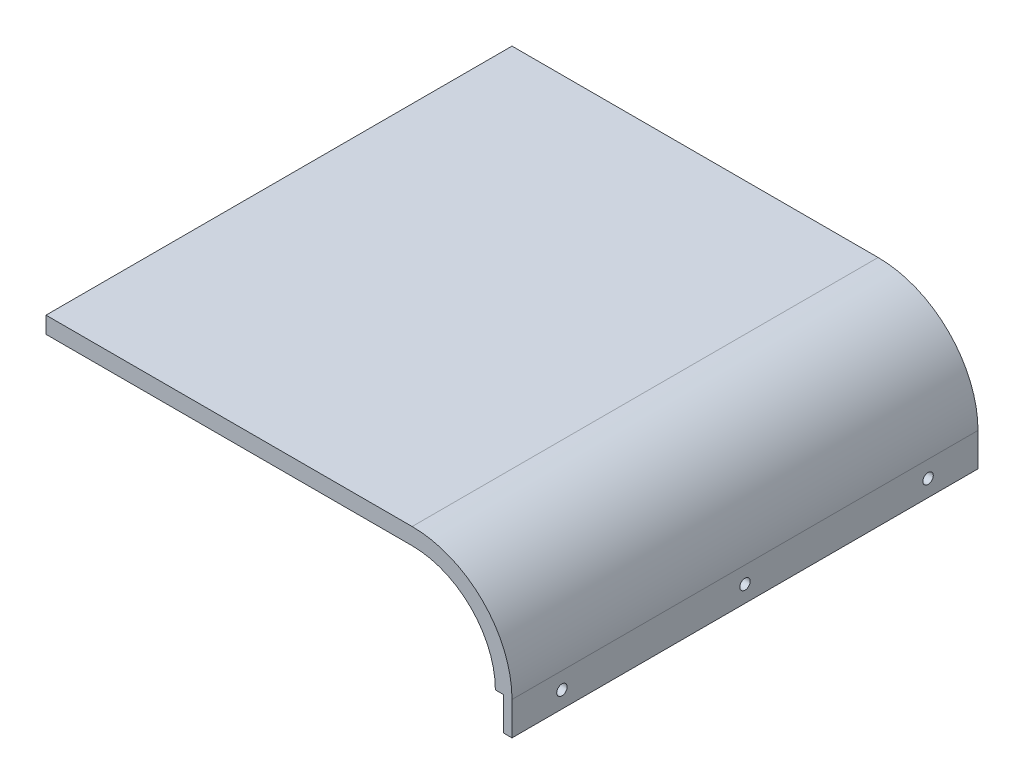
ISO-10303-21;
HEADER;
FILE_DESCRIPTION(('STEP AP214'),'2;1');
FILE_NAME('part.step','',(''),(''),'','','');
FILE_SCHEMA(('AUTOMOTIVE_DESIGN { 1 0 10303 214 1 1 1 1 }'));
ENDSEC;
DATA;
#1=APPLICATION_CONTEXT('core data for automotive mechanical design processes');
#2=APPLICATION_PROTOCOL_DEFINITION('international standard','automotive_design',2000,#1);
#3=PRODUCT_CONTEXT('',#1,'mechanical');
#4=PRODUCT('Part','Part','',(#3));
#5=PRODUCT_RELATED_PRODUCT_CATEGORY('part','',(#4));
#6=PRODUCT_DEFINITION_FORMATION('','',#4);
#7=PRODUCT_DEFINITION_CONTEXT('part definition',#1,'design');
#8=PRODUCT_DEFINITION('design','',#6,#7);
#9=PRODUCT_DEFINITION_SHAPE('','',#8);
#10=(LENGTH_UNIT() NAMED_UNIT(*) SI_UNIT(.MILLI.,.METRE.));
#11=(NAMED_UNIT(*) PLANE_ANGLE_UNIT() SI_UNIT($,.RADIAN.));
#12=(NAMED_UNIT(*) SI_UNIT($,.STERADIAN.) SOLID_ANGLE_UNIT());
#13=UNCERTAINTY_MEASURE_WITH_UNIT(LENGTH_MEASURE(1.E-05),#10,'distance_accuracy_value','');
#14=(GEOMETRIC_REPRESENTATION_CONTEXT(3) GLOBAL_UNCERTAINTY_ASSIGNED_CONTEXT((#13)) GLOBAL_UNIT_ASSIGNED_CONTEXT((#10,
#11,#12)) REPRESENTATION_CONTEXT('',''));
#15=CARTESIAN_POINT('',(0.,0.,0.));
#16=DIRECTION('',(0.,0.,1.));
#17=DIRECTION('',(1.,0.,0.));
#18=AXIS2_PLACEMENT_3D('',#15,#16,#17);
#19=CARTESIAN_POINT('',(139.7,-76.2,-177.8));
#20=DIRECTION('',(0.,0.,1.));
#21=DIRECTION('',(1.,0.,0.));
#22=AXIS2_PLACEMENT_3D('',#19,#20,#21);
#23=CYLINDRICAL_SURFACE('',#22,76.2);
#24=DIRECTION('',(0.,0.,1.));
#25=VECTOR('',#24,1.);
#26=CARTESIAN_POINT('',(139.7,0.,-177.8));
#27=LINE('',#26,#25);
#28=CARTESIAN_POINT('',(139.7,0.,-177.8));
#29=VERTEX_POINT('',#28);
#30=CARTESIAN_POINT('',(139.7,0.,177.8));
#31=VERTEX_POINT('',#30);
#32=EDGE_CURVE('E48',#29,#31,#27,.T.);
#33=ORIENTED_EDGE('',*,*,#32,.T.);
#34=CARTESIAN_POINT('',(139.7,-76.2,177.8));
#35=DIRECTION('',(0.,0.,1.));
#36=DIRECTION('',(-1.,0.,0.));
#37=AXIS2_PLACEMENT_3D('',#34,#35,#36);
#38=CIRCLE('',#37,76.2);
#39=CARTESIAN_POINT('',(215.9,-76.2,177.8));
#40=VERTEX_POINT('',#39);
#41=EDGE_CURVE('E143',#40,#31,#38,.T.);
#42=ORIENTED_EDGE('',*,*,#41,.F.);
#43=DIRECTION('',(0.,0.,1.));
#44=VECTOR('',#43,1.);
#45=CARTESIAN_POINT('',(215.9,-76.2,-177.8));
#46=LINE('',#45,#44);
#47=CARTESIAN_POINT('',(215.9,-76.2,-177.8));
#48=VERTEX_POINT('',#47);
#49=EDGE_CURVE('E11',#48,#40,#46,.T.);
#50=ORIENTED_EDGE('',*,*,#49,.F.);
#51=CARTESIAN_POINT('',(139.7,-76.2,-177.8));
#52=DIRECTION('',(0.,0.,1.));
#53=DIRECTION('',(-1.,0.,0.));
#54=AXIS2_PLACEMENT_3D('',#51,#52,#53);
#55=CIRCLE('',#54,76.2);
#56=EDGE_CURVE('E172',#48,#29,#55,.T.);
#57=ORIENTED_EDGE('',*,*,#56,.T.);
#58=EDGE_LOOP('',(#33,#42,#50,#57));
#59=FACE_BOUND('',#58,.T.);
#60=ADVANCED_FACE('F45',(#59),#23,.T.);
#61=CARTESIAN_POINT('',(215.9,-76.2,-177.8));
#62=DIRECTION('',(0.,-1.,0.));
#63=DIRECTION('',(0.,0.,-1.));
#64=AXIS2_PLACEMENT_3D('',#61,#62,#63);
#65=PLANE('',#64);
#66=DIRECTION('',(0.,0.,-1.));
#67=VECTOR('',#66,1.);
#68=CARTESIAN_POINT('',(209.55,-76.2,177.8));
#69=LINE('',#68,#67);
#70=CARTESIAN_POINT('',(209.55,-76.2,177.8));
#71=VERTEX_POINT('',#70);
#72=CARTESIAN_POINT('',(209.55,-76.2,-177.8));
#73=VERTEX_POINT('',#72);
#74=EDGE_CURVE('E62',#71,#73,#69,.T.);
#75=ORIENTED_EDGE('',*,*,#74,.F.);
#76=DIRECTION('',(1.,0.,0.));
#77=VECTOR('',#76,1.);
#78=CARTESIAN_POINT('',(215.9,-76.2,177.8));
#79=LINE('',#78,#77);
#80=CARTESIAN_POINT('',(203.2,-76.2,177.8));
#81=VERTEX_POINT('',#80);
#82=EDGE_CURVE('E169',#81,#71,#79,.T.);
#83=ORIENTED_EDGE('',*,*,#82,.F.);
#84=DIRECTION('',(0.,0.,1.));
#85=VECTOR('',#84,1.);
#86=CARTESIAN_POINT('',(203.2,-76.2,-177.8));
#87=LINE('',#86,#85);
#88=CARTESIAN_POINT('',(203.2,-76.2,-177.8));
#89=VERTEX_POINT('',#88);
#90=EDGE_CURVE('E54',#89,#81,#87,.T.);
#91=ORIENTED_EDGE('',*,*,#90,.F.);
#92=DIRECTION('',(1.,0.,0.));
#93=VECTOR('',#92,1.);
#94=CARTESIAN_POINT('',(215.9,-76.2,-177.8));
#95=LINE('',#94,#93);
#96=EDGE_CURVE('E191',#89,#73,#95,.T.);
#97=ORIENTED_EDGE('',*,*,#96,.T.);
#98=EDGE_LOOP('',(#75,#83,#91,#97));
#99=FACE_BOUND('',#98,.T.);
#100=ADVANCED_FACE('F278',(#99),#65,.T.);
#101=CARTESIAN_POINT('',(139.7,-76.2,-177.8));
#102=DIRECTION('',(0.,0.,1.));
#103=DIRECTION('',(1.,0.,0.));
#104=AXIS2_PLACEMENT_3D('',#101,#102,#103);
#105=CYLINDRICAL_SURFACE('',#104,63.5);
#106=ORIENTED_EDGE('',*,*,#90,.T.);
#107=CARTESIAN_POINT('',(139.7,-76.2,177.8));
#108=DIRECTION('',(0.,0.,-1.));
#109=DIRECTION('',(-1.,0.,0.));
#110=AXIS2_PLACEMENT_3D('',#107,#108,#109);
#111=CIRCLE('',#110,63.5);
#112=CARTESIAN_POINT('',(139.7,-12.7,177.8));
#113=VERTEX_POINT('',#112);
#114=EDGE_CURVE('E165',#113,#81,#111,.T.);
#115=ORIENTED_EDGE('',*,*,#114,.F.);
#116=DIRECTION('',(0.,0.,1.));
#117=VECTOR('',#116,1.);
#118=CARTESIAN_POINT('',(139.7,-12.7,-177.8));
#119=LINE('',#118,#117);
#120=CARTESIAN_POINT('',(139.7,-12.7,-177.8));
#121=VERTEX_POINT('',#120);
#122=EDGE_CURVE('E196',#121,#113,#119,.T.);
#123=ORIENTED_EDGE('',*,*,#122,.F.);
#124=CARTESIAN_POINT('',(139.7,-76.2,-177.8));
#125=DIRECTION('',(0.,0.,-1.));
#126=DIRECTION('',(-1.,0.,0.));
#127=AXIS2_PLACEMENT_3D('',#124,#125,#126);
#128=CIRCLE('',#127,63.5);
#129=EDGE_CURVE('E187',#121,#89,#128,.T.);
#130=ORIENTED_EDGE('',*,*,#129,.T.);
#131=EDGE_LOOP('',(#106,#115,#123,#130));
#132=FACE_BOUND('',#131,.T.);
#133=ADVANCED_FACE('F283',(#132),#105,.F.);
#134=CARTESIAN_POINT('',(-139.7,-12.7,-177.8));
#135=DIRECTION('',(0.,-1.,0.));
#136=DIRECTION('',(0.,0.,-1.));
#137=AXIS2_PLACEMENT_3D('',#134,#135,#136);
#138=PLANE('',#137);
#139=ORIENTED_EDGE('',*,*,#122,.T.);
#140=DIRECTION('',(1.,0.,0.));
#141=VECTOR('',#140,1.);
#142=CARTESIAN_POINT('',(-139.7,-12.7,177.8));
#143=LINE('',#142,#141);
#144=CARTESIAN_POINT('',(-139.7,-12.7,177.8));
#145=VERTEX_POINT('',#144);
#146=EDGE_CURVE('E161',#145,#113,#143,.T.);
#147=ORIENTED_EDGE('',*,*,#146,.F.);
#148=DIRECTION('',(0.,0.,1.));
#149=VECTOR('',#148,1.);
#150=CARTESIAN_POINT('',(-139.7,-12.7,-177.8));
#151=LINE('',#150,#149);
#152=CARTESIAN_POINT('',(-139.7,-12.7,-177.8));
#153=VERTEX_POINT('',#152);
#154=EDGE_CURVE('E199',#153,#145,#151,.T.);
#155=ORIENTED_EDGE('',*,*,#154,.F.);
#156=DIRECTION('',(1.,0.,0.));
#157=VECTOR('',#156,1.);
#158=CARTESIAN_POINT('',(-139.7,-12.7,-177.8));
#159=LINE('',#158,#157);
#160=EDGE_CURVE('E183',#153,#121,#159,.T.);
#161=ORIENTED_EDGE('',*,*,#160,.T.);
#162=EDGE_LOOP('',(#139,#147,#155,#161));
#163=FACE_BOUND('',#162,.T.);
#164=ADVANCED_FACE('F289',(#163),#138,.T.);
#165=CARTESIAN_POINT('',(-139.7,0.,-177.8));
#166=DIRECTION('',(-1.,0.,0.));
#167=DIRECTION('',(0.,0.,1.));
#168=AXIS2_PLACEMENT_3D('',#165,#166,#167);
#169=PLANE('',#168);
#170=ORIENTED_EDGE('',*,*,#154,.T.);
#171=DIRECTION('',(0.,-1.,0.));
#172=VECTOR('',#171,1.);
#173=CARTESIAN_POINT('',(-139.7,0.,177.8));
#174=LINE('',#173,#172);
#175=CARTESIAN_POINT('',(-139.7,0.,177.8));
#176=VERTEX_POINT('',#175);
#177=EDGE_CURVE('E157',#176,#145,#174,.T.);
#178=ORIENTED_EDGE('',*,*,#177,.F.);
#179=DIRECTION('',(0.,0.,1.));
#180=VECTOR('',#179,1.);
#181=CARTESIAN_POINT('',(-139.7,0.,-177.8));
#182=LINE('',#181,#180);
#183=CARTESIAN_POINT('',(-139.7,0.,-177.8));
#184=VERTEX_POINT('',#183);
#185=EDGE_CURVE('E201',#184,#176,#182,.T.);
#186=ORIENTED_EDGE('',*,*,#185,.F.);
#187=DIRECTION('',(0.,-1.,0.));
#188=VECTOR('',#187,1.);
#189=CARTESIAN_POINT('',(-139.7,0.,-177.8));
#190=LINE('',#189,#188);
#191=EDGE_CURVE('E179',#184,#153,#190,.T.);
#192=ORIENTED_EDGE('',*,*,#191,.T.);
#193=EDGE_LOOP('',(#170,#178,#186,#192));
#194=FACE_BOUND('',#193,.T.);
#195=ADVANCED_FACE('F296',(#194),#169,.T.);
#196=CARTESIAN_POINT('',(-139.7,0.,-177.8));
#197=DIRECTION('',(0.,1.,0.));
#198=DIRECTION('',(0.,0.,1.));
#199=AXIS2_PLACEMENT_3D('',#196,#197,#198);
#200=PLANE('',#199);
#201=ORIENTED_EDGE('',*,*,#185,.T.);
#202=DIRECTION('',(-1.,0.,0.));
#203=VECTOR('',#202,1.);
#204=CARTESIAN_POINT('',(-139.7,0.,177.8));
#205=LINE('',#204,#203);
#206=EDGE_CURVE('E148',#31,#176,#205,.T.);
#207=ORIENTED_EDGE('',*,*,#206,.F.);
#208=ORIENTED_EDGE('',*,*,#32,.F.);
#209=DIRECTION('',(-1.,0.,0.));
#210=VECTOR('',#209,1.);
#211=CARTESIAN_POINT('',(-139.7,0.,-177.8));
#212=LINE('',#211,#210);
#213=EDGE_CURVE('E175',#29,#184,#212,.T.);
#214=ORIENTED_EDGE('',*,*,#213,.T.);
#215=EDGE_LOOP('',(#201,#207,#208,#214));
#216=FACE_BOUND('',#215,.T.);
#217=ADVANCED_FACE('F207',(#216),#200,.T.);
#218=CARTESIAN_POINT('',(139.7,-76.2,-177.8));
#219=DIRECTION('',(0.,0.,-1.));
#220=DIRECTION('',(-1.,0.,0.));
#221=AXIS2_PLACEMENT_3D('',#218,#219,#220);
#222=PLANE('',#221);
#223=ORIENTED_EDGE('',*,*,#56,.F.);
#224=DIRECTION('',(0.,1.,0.));
#225=VECTOR('',#224,1.);
#226=CARTESIAN_POINT('',(215.9,-101.6,-177.8));
#227=LINE('',#226,#225);
#228=CARTESIAN_POINT('',(215.9,-101.6,-177.8));
#229=VERTEX_POINT('',#228);
#230=EDGE_CURVE('E125',#229,#48,#227,.T.);
#231=ORIENTED_EDGE('',*,*,#230,.F.);
#232=DIRECTION('',(1.,0.,0.));
#233=VECTOR('',#232,1.);
#234=CARTESIAN_POINT('',(209.55,-101.6,-177.8));
#235=LINE('',#234,#233);
#236=CARTESIAN_POINT('',(209.55,-101.6,-177.8));
#237=VERTEX_POINT('',#236);
#238=EDGE_CURVE('E118',#237,#229,#235,.T.);
#239=ORIENTED_EDGE('',*,*,#238,.F.);
#240=DIRECTION('',(0.,1.,0.));
#241=VECTOR('',#240,1.);
#242=CARTESIAN_POINT('',(209.55,-101.6,-177.8));
#243=LINE('',#242,#241);
#244=EDGE_CURVE('E123',#237,#73,#243,.T.);
#245=ORIENTED_EDGE('',*,*,#244,.T.);
#246=ORIENTED_EDGE('',*,*,#96,.F.);
#247=ORIENTED_EDGE('',*,*,#129,.F.);
#248=ORIENTED_EDGE('',*,*,#160,.F.);
#249=ORIENTED_EDGE('',*,*,#191,.F.);
#250=ORIENTED_EDGE('',*,*,#213,.F.);
#251=EDGE_LOOP('',(#223,#231,#239,#245,#246,#247,#248,#249,#250));
#252=FACE_BOUND('',#251,.T.);
#253=ADVANCED_FACE('F120',(#252),#222,.T.);
#254=CARTESIAN_POINT('',(139.7,-76.2,177.8));
#255=DIRECTION('',(0.,0.,-1.));
#256=DIRECTION('',(-1.,0.,0.));
#257=AXIS2_PLACEMENT_3D('',#254,#255,#256);
#258=PLANE('',#257);
#259=ORIENTED_EDGE('',*,*,#41,.T.);
#260=ORIENTED_EDGE('',*,*,#206,.T.);
#261=ORIENTED_EDGE('',*,*,#177,.T.);
#262=ORIENTED_EDGE('',*,*,#146,.T.);
#263=ORIENTED_EDGE('',*,*,#114,.T.);
#264=ORIENTED_EDGE('',*,*,#82,.T.);
#265=DIRECTION('',(0.,1.,0.));
#266=VECTOR('',#265,1.);
#267=CARTESIAN_POINT('',(209.55,-101.6,177.8));
#268=LINE('',#267,#266);
#269=CARTESIAN_POINT('',(209.55,-101.6,177.8));
#270=VERTEX_POINT('',#269);
#271=EDGE_CURVE('E215',#270,#71,#268,.T.);
#272=ORIENTED_EDGE('',*,*,#271,.F.);
#273=DIRECTION('',(-1.,0.,0.));
#274=VECTOR('',#273,1.);
#275=CARTESIAN_POINT('',(209.55,-101.6,177.8));
#276=LINE('',#275,#274);
#277=CARTESIAN_POINT('',(215.9,-101.6,177.8));
#278=VERTEX_POINT('',#277);
#279=EDGE_CURVE('E135',#278,#270,#276,.T.);
#280=ORIENTED_EDGE('',*,*,#279,.F.);
#281=DIRECTION('',(0.,1.,0.));
#282=VECTOR('',#281,1.);
#283=CARTESIAN_POINT('',(215.9,-101.6,177.8));
#284=LINE('',#283,#282);
#285=EDGE_CURVE('E150',#278,#40,#284,.T.);
#286=ORIENTED_EDGE('',*,*,#285,.T.);
#287=EDGE_LOOP('',(#259,#260,#261,#262,#263,#264,#272,#280,#286));
#288=FACE_BOUND('',#287,.T.);
#289=ADVANCED_FACE('F211',(#288),#258,.F.);
#290=CARTESIAN_POINT('',(209.55,-101.6,177.8));
#291=DIRECTION('',(1.,0.,0.));
#292=DIRECTION('',(0.,0.,-1.));
#293=AXIS2_PLACEMENT_3D('',#290,#291,#292);
#294=PLANE('',#293);
#295=CARTESIAN_POINT('',(209.55,-88.9,139.7));
#296=DIRECTION('',(1.,0.,0.));
#297=DIRECTION('',(0.,0.,-1.));
#298=AXIS2_PLACEMENT_3D('',#295,#296,#297);
#299=CIRCLE('',#298,3.96874999999999);
#300=CARTESIAN_POINT('',(209.55,-88.9,135.73125));
#301=VERTEX_POINT('',#300);
#302=EDGE_CURVE('E221',#301,#301,#299,.T.);
#303=ORIENTED_EDGE('',*,*,#302,.T.);
#304=EDGE_LOOP('',(#303));
#305=FACE_BOUND('',#304,.T.);
#306=CARTESIAN_POINT('',(209.55,-88.9,0.));
#307=DIRECTION('',(1.,0.,0.));
#308=DIRECTION('',(0.,0.,-1.));
#309=AXIS2_PLACEMENT_3D('',#306,#307,#308);
#310=CIRCLE('',#309,3.96875);
#311=CARTESIAN_POINT('',(209.55,-88.9,-3.96875));
#312=VERTEX_POINT('',#311);
#313=EDGE_CURVE('E229',#312,#312,#310,.T.);
#314=ORIENTED_EDGE('',*,*,#313,.T.);
#315=EDGE_LOOP('',(#314));
#316=FACE_BOUND('',#315,.T.);
#317=CARTESIAN_POINT('',(209.55,-88.9,-139.7));
#318=DIRECTION('',(1.,0.,0.));
#319=DIRECTION('',(0.,0.,-1.));
#320=AXIS2_PLACEMENT_3D('',#317,#318,#319);
#321=CIRCLE('',#320,3.96874999999999);
#322=CARTESIAN_POINT('',(209.55,-88.9,-143.66875));
#323=VERTEX_POINT('',#322);
#324=EDGE_CURVE('E233',#323,#323,#321,.T.);
#325=ORIENTED_EDGE('',*,*,#324,.T.);
#326=EDGE_LOOP('',(#325));
#327=FACE_BOUND('',#326,.T.);
#328=ORIENTED_EDGE('',*,*,#74,.T.);
#329=ORIENTED_EDGE('',*,*,#244,.F.);
#330=DIRECTION('',(0.,0.,-1.));
#331=VECTOR('',#330,1.);
#332=CARTESIAN_POINT('',(209.55,-101.6,177.8));
#333=LINE('',#332,#331);
#334=EDGE_CURVE('E130',#270,#237,#333,.T.);
#335=ORIENTED_EDGE('',*,*,#334,.F.);
#336=ORIENTED_EDGE('',*,*,#271,.T.);
#337=EDGE_LOOP('',(#328,#329,#335,#336));
#338=FACE_BOUND('',#337,.T.);
#339=ADVANCED_FACE('F141',(#305,#316,#327,#338),#294,.F.);
#340=CARTESIAN_POINT('',(215.9,-101.6,177.8));
#341=DIRECTION('',(-1.,0.,0.));
#342=DIRECTION('',(0.,0.,1.));
#343=AXIS2_PLACEMENT_3D('',#340,#341,#342);
#344=PLANE('',#343);
#345=CARTESIAN_POINT('',(215.9,-88.9,139.7));
#346=DIRECTION('',(1.,0.,0.));
#347=DIRECTION('',(0.,0.,-1.));
#348=AXIS2_PLACEMENT_3D('',#345,#346,#347);
#349=CIRCLE('',#348,3.96874999999999);
#350=CARTESIAN_POINT('',(215.9,-88.9,135.73125));
#351=VERTEX_POINT('',#350);
#352=EDGE_CURVE('E237',#351,#351,#349,.T.);
#353=ORIENTED_EDGE('',*,*,#352,.F.);
#354=EDGE_LOOP('',(#353));
#355=FACE_BOUND('',#354,.T.);
#356=CARTESIAN_POINT('',(215.9,-88.9,0.));
#357=DIRECTION('',(1.,0.,0.));
#358=DIRECTION('',(0.,0.,-1.));
#359=AXIS2_PLACEMENT_3D('',#356,#357,#358);
#360=CIRCLE('',#359,3.96875);
#361=CARTESIAN_POINT('',(215.9,-88.9,-3.96875));
#362=VERTEX_POINT('',#361);
#363=EDGE_CURVE('E242',#362,#362,#360,.T.);
#364=ORIENTED_EDGE('',*,*,#363,.F.);
#365=EDGE_LOOP('',(#364));
#366=FACE_BOUND('',#365,.T.);
#367=CARTESIAN_POINT('',(215.9,-88.9,-139.7));
#368=DIRECTION('',(1.,0.,0.));
#369=DIRECTION('',(0.,0.,-1.));
#370=AXIS2_PLACEMENT_3D('',#367,#368,#369);
#371=CIRCLE('',#370,3.96874999999999);
#372=CARTESIAN_POINT('',(215.9,-88.9,-143.66875));
#373=VERTEX_POINT('',#372);
#374=EDGE_CURVE('E238',#373,#373,#371,.T.);
#375=ORIENTED_EDGE('',*,*,#374,.F.);
#376=EDGE_LOOP('',(#375));
#377=FACE_BOUND('',#376,.T.);
#378=ORIENTED_EDGE('',*,*,#49,.T.);
#379=ORIENTED_EDGE('',*,*,#285,.F.);
#380=DIRECTION('',(0.,0.,1.));
#381=VECTOR('',#380,1.);
#382=CARTESIAN_POINT('',(215.9,-101.6,177.8));
#383=LINE('',#382,#381);
#384=EDGE_CURVE('E129',#229,#278,#383,.T.);
#385=ORIENTED_EDGE('',*,*,#384,.F.);
#386=ORIENTED_EDGE('',*,*,#230,.T.);
#387=EDGE_LOOP('',(#378,#379,#385,#386));
#388=FACE_BOUND('',#387,.T.);
#389=ADVANCED_FACE('F253',(#355,#366,#377,#388),#344,.F.);
#390=CARTESIAN_POINT('',(0.,-101.6,0.));
#391=DIRECTION('',(0.,-1.,0.));
#392=DIRECTION('',(0.,0.,-1.));
#393=AXIS2_PLACEMENT_3D('',#390,#391,#392);
#394=PLANE('',#393);
#395=ORIENTED_EDGE('',*,*,#334,.T.);
#396=ORIENTED_EDGE('',*,*,#238,.T.);
#397=ORIENTED_EDGE('',*,*,#384,.T.);
#398=ORIENTED_EDGE('',*,*,#279,.T.);
#399=EDGE_LOOP('',(#395,#396,#397,#398));
#400=FACE_BOUND('',#399,.T.);
#401=ADVANCED_FACE('F133',(#400),#394,.T.);
#402=CARTESIAN_POINT('',(190.5,-88.9,-139.7));
#403=DIRECTION('',(1.,0.,0.));
#404=DIRECTION('',(0.,0.,-1.));
#405=AXIS2_PLACEMENT_3D('',#402,#403,#404);
#406=CYLINDRICAL_SURFACE('',#405,3.96874999999999);
#407=ORIENTED_EDGE('',*,*,#374,.T.);
#408=EDGE_LOOP('',(#407));
#409=FACE_BOUND('',#408,.T.);
#410=ORIENTED_EDGE('',*,*,#324,.F.);
#411=EDGE_LOOP('',(#410));
#412=FACE_BOUND('',#411,.T.);
#413=ADVANCED_FACE('F261',(#409,#412),#406,.F.);
#414=CARTESIAN_POINT('',(190.5,-88.9,0.));
#415=DIRECTION('',(1.,0.,0.));
#416=DIRECTION('',(0.,0.,-1.));
#417=AXIS2_PLACEMENT_3D('',#414,#415,#416);
#418=CYLINDRICAL_SURFACE('',#417,3.96875);
#419=ORIENTED_EDGE('',*,*,#363,.T.);
#420=EDGE_LOOP('',(#419));
#421=FACE_BOUND('',#420,.T.);
#422=ORIENTED_EDGE('',*,*,#313,.F.);
#423=EDGE_LOOP('',(#422));
#424=FACE_BOUND('',#423,.T.);
#425=ADVANCED_FACE('F264',(#421,#424),#418,.F.);
#426=CARTESIAN_POINT('',(190.5,-88.9,139.7));
#427=DIRECTION('',(1.,0.,0.));
#428=DIRECTION('',(0.,0.,-1.));
#429=AXIS2_PLACEMENT_3D('',#426,#427,#428);
#430=CYLINDRICAL_SURFACE('',#429,3.96874999999999);
#431=ORIENTED_EDGE('',*,*,#352,.T.);
#432=EDGE_LOOP('',(#431));
#433=FACE_BOUND('',#432,.T.);
#434=ORIENTED_EDGE('',*,*,#302,.F.);
#435=EDGE_LOOP('',(#434));
#436=FACE_BOUND('',#435,.T.);
#437=ADVANCED_FACE('F250',(#433,#436),#430,.F.);
#438=CLOSED_SHELL('',(#60,#100,#133,#164,#195,#217,#253,#289,#339,#389,#401,#413,#425,#437));
#439=MANIFOLD_SOLID_BREP('B2',#438);
#440=ADVANCED_BREP_SHAPE_REPRESENTATION('',(#18,#439),#14);
#441=SHAPE_DEFINITION_REPRESENTATION(#9,#440);
ENDSEC;
END-ISO-10303-21;
